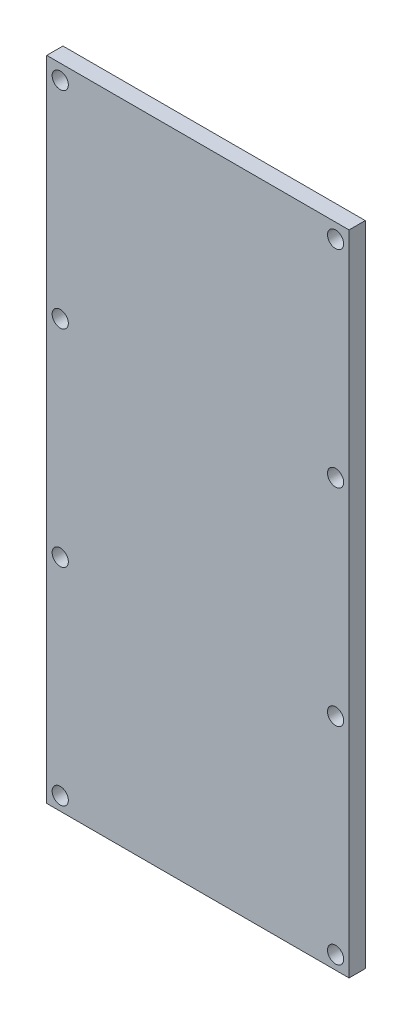
ISO-10303-21;
HEADER;
FILE_DESCRIPTION(('STEP AP214'),'2;1');
FILE_NAME('part.step','',(''),(''),'','','');
FILE_SCHEMA(('AUTOMOTIVE_DESIGN { 1 0 10303 214 1 1 1 1 }'));
ENDSEC;
DATA;
#1=APPLICATION_CONTEXT('core data for automotive mechanical design processes');
#2=APPLICATION_PROTOCOL_DEFINITION('international standard','automotive_design',2000,#1);
#3=PRODUCT_CONTEXT('',#1,'mechanical');
#4=PRODUCT('Part','Part','',(#3));
#5=PRODUCT_RELATED_PRODUCT_CATEGORY('part','',(#4));
#6=PRODUCT_DEFINITION_FORMATION('','',#4);
#7=PRODUCT_DEFINITION_CONTEXT('part definition',#1,'design');
#8=PRODUCT_DEFINITION('design','',#6,#7);
#9=PRODUCT_DEFINITION_SHAPE('','',#8);
#10=(LENGTH_UNIT() NAMED_UNIT(*) SI_UNIT(.MILLI.,.METRE.));
#11=(NAMED_UNIT(*) PLANE_ANGLE_UNIT() SI_UNIT($,.RADIAN.));
#12=(NAMED_UNIT(*) SI_UNIT($,.STERADIAN.) SOLID_ANGLE_UNIT());
#13=UNCERTAINTY_MEASURE_WITH_UNIT(LENGTH_MEASURE(1.E-05),#10,'distance_accuracy_value','');
#14=(GEOMETRIC_REPRESENTATION_CONTEXT(3) GLOBAL_UNCERTAINTY_ASSIGNED_CONTEXT((#13)) GLOBAL_UNIT_ASSIGNED_CONTEXT((#10,
#11,#12)) REPRESENTATION_CONTEXT('',''));
#15=CARTESIAN_POINT('',(0.,0.,0.));
#16=DIRECTION('',(0.,0.,1.));
#17=DIRECTION('',(1.,0.,0.));
#18=AXIS2_PLACEMENT_3D('',#15,#16,#17);
#19=CARTESIAN_POINT('',(0.,0.,0.));
#20=DIRECTION('',(0.,0.,-1.));
#21=DIRECTION('',(-1.,0.,0.));
#22=AXIS2_PLACEMENT_3D('',#19,#20,#21);
#23=PLANE('',#22);
#24=CARTESIAN_POINT('',(-60.5000000000004,104.25,0.));
#25=DIRECTION('',(0.,0.,1.));
#26=DIRECTION('',(1.,0.,0.));
#27=AXIS2_PLACEMENT_3D('',#24,#25,#26);
#28=CIRCLE('',#27,1.5);
#29=CARTESIAN_POINT('',(-59.0000000000004,104.25,0.));
#30=VERTEX_POINT('',#29);
#31=EDGE_CURVE('E162',#30,#30,#28,.T.);
#32=ORIENTED_EDGE('',*,*,#31,.T.);
#33=EDGE_LOOP('',(#32));
#34=FACE_BOUND('',#33,.T.);
#35=CARTESIAN_POINT('',(-60.5000000000001,27.75,0.));
#36=DIRECTION('',(0.,0.,1.));
#37=DIRECTION('',(1.,0.,0.));
#38=AXIS2_PLACEMENT_3D('',#35,#36,#37);
#39=CIRCLE('',#38,1.5);
#40=CARTESIAN_POINT('',(-59.0000000000001,27.75,0.));
#41=VERTEX_POINT('',#40);
#42=EDGE_CURVE('E186',#41,#41,#39,.T.);
#43=ORIENTED_EDGE('',*,*,#42,.T.);
#44=EDGE_LOOP('',(#43));
#45=FACE_BOUND('',#44,.T.);
#46=CARTESIAN_POINT('',(-111.5,65.9999999999996,0.));
#47=DIRECTION('',(0.,0.,1.));
#48=DIRECTION('',(1.,0.,0.));
#49=AXIS2_PLACEMENT_3D('',#46,#47,#48);
#50=CIRCLE('',#49,1.50000000000001);
#51=CARTESIAN_POINT('',(-110.,65.9999999999996,0.));
#52=VERTEX_POINT('',#51);
#53=EDGE_CURVE('E198',#52,#52,#50,.T.);
#54=ORIENTED_EDGE('',*,*,#53,.T.);
#55=EDGE_LOOP('',(#54));
#56=FACE_BOUND('',#55,.T.);
#57=CARTESIAN_POINT('',(-111.5,-10.5000000000004,0.));
#58=DIRECTION('',(0.,0.,1.));
#59=DIRECTION('',(1.,0.,0.));
#60=AXIS2_PLACEMENT_3D('',#57,#58,#59);
#61=CIRCLE('',#60,1.5);
#62=CARTESIAN_POINT('',(-110.,-10.5000000000004,0.));
#63=VERTEX_POINT('',#62);
#64=EDGE_CURVE('E210',#63,#63,#61,.T.);
#65=ORIENTED_EDGE('',*,*,#64,.T.);
#66=EDGE_LOOP('',(#65));
#67=FACE_BOUND('',#66,.T.);
#68=DIRECTION('',(0.,1.,0.));
#69=VECTOR('',#68,1.);
#70=CARTESIAN_POINT('',(-58.,107.,0.));
#71=LINE('',#70,#69);
#72=CARTESIAN_POINT('',(-58.,-13.,0.));
#73=VERTEX_POINT('',#72);
#74=CARTESIAN_POINT('',(-58.,107.,0.));
#75=VERTEX_POINT('',#74);
#76=EDGE_CURVE('E222',#73,#75,#71,.T.);
#77=ORIENTED_EDGE('',*,*,#76,.F.);
#78=DIRECTION('',(1.,0.,0.));
#79=VECTOR('',#78,1.);
#80=CARTESIAN_POINT('',(-58.,-13.,0.));
#81=LINE('',#80,#79);
#82=CARTESIAN_POINT('',(-114.,-13.,0.));
#83=VERTEX_POINT('',#82);
#84=EDGE_CURVE('E229',#83,#73,#81,.T.);
#85=ORIENTED_EDGE('',*,*,#84,.F.);
#86=DIRECTION('',(0.,-1.,0.));
#87=VECTOR('',#86,1.);
#88=CARTESIAN_POINT('',(-114.,107.,0.));
#89=LINE('',#88,#87);
#90=CARTESIAN_POINT('',(-114.,107.,0.));
#91=VERTEX_POINT('',#90);
#92=EDGE_CURVE('E240',#91,#83,#89,.T.);
#93=ORIENTED_EDGE('',*,*,#92,.F.);
#94=DIRECTION('',(-1.,0.,0.));
#95=VECTOR('',#94,1.);
#96=CARTESIAN_POINT('',(-58.,107.,0.));
#97=LINE('',#96,#95);
#98=EDGE_CURVE('E238',#75,#91,#97,.T.);
#99=ORIENTED_EDGE('',*,*,#98,.F.);
#100=EDGE_LOOP('',(#77,#85,#93,#99));
#101=FACE_BOUND('',#100,.T.);
#102=CARTESIAN_POINT('',(-60.5,-10.5,0.));
#103=DIRECTION('',(0.,0.,1.));
#104=DIRECTION('',(1.,0.,0.));
#105=AXIS2_PLACEMENT_3D('',#102,#103,#104);
#106=CIRCLE('',#105,1.5);
#107=CARTESIAN_POINT('',(-59.,-10.5,0.));
#108=VERTEX_POINT('',#107);
#109=EDGE_CURVE('E216',#108,#108,#106,.T.);
#110=ORIENTED_EDGE('',*,*,#109,.T.);
#111=EDGE_LOOP('',(#110));
#112=FACE_BOUND('',#111,.T.);
#113=CARTESIAN_POINT('',(-111.5,27.7499999999996,0.));
#114=DIRECTION('',(0.,0.,1.));
#115=DIRECTION('',(1.,0.,0.));
#116=AXIS2_PLACEMENT_3D('',#113,#114,#115);
#117=CIRCLE('',#116,1.50000000000001);
#118=CARTESIAN_POINT('',(-110.,27.7499999999996,0.));
#119=VERTEX_POINT('',#118);
#120=EDGE_CURVE('E204',#119,#119,#117,.T.);
#121=ORIENTED_EDGE('',*,*,#120,.T.);
#122=EDGE_LOOP('',(#121));
#123=FACE_BOUND('',#122,.T.);
#124=CARTESIAN_POINT('',(-111.5,104.25,0.));
#125=DIRECTION('',(0.,0.,1.));
#126=DIRECTION('',(1.,0.,0.));
#127=AXIS2_PLACEMENT_3D('',#124,#125,#126);
#128=CIRCLE('',#127,1.50000000000001);
#129=CARTESIAN_POINT('',(-110.,104.25,0.));
#130=VERTEX_POINT('',#129);
#131=EDGE_CURVE('E192',#130,#130,#128,.T.);
#132=ORIENTED_EDGE('',*,*,#131,.T.);
#133=EDGE_LOOP('',(#132));
#134=FACE_BOUND('',#133,.T.);
#135=CARTESIAN_POINT('',(-60.5000000000003,66.,0.));
#136=DIRECTION('',(0.,0.,1.));
#137=DIRECTION('',(1.,0.,0.));
#138=AXIS2_PLACEMENT_3D('',#135,#136,#137);
#139=CIRCLE('',#138,1.5);
#140=CARTESIAN_POINT('',(-59.0000000000003,66.,0.));
#141=VERTEX_POINT('',#140);
#142=EDGE_CURVE('E180',#141,#141,#139,.T.);
#143=ORIENTED_EDGE('',*,*,#142,.T.);
#144=EDGE_LOOP('',(#143));
#145=FACE_BOUND('',#144,.T.);
#146=DIRECTION('',(1.,0.,0.));
#147=VECTOR('',#146,1.);
#148=CARTESIAN_POINT('',(0.,-8.00000000000002,0.));
#149=LINE('',#148,#147);
#150=CARTESIAN_POINT('',(-109.,-8.00000000000001,0.));
#151=VERTEX_POINT('',#150);
#152=CARTESIAN_POINT('',(-63.,-8.00000000000001,0.));
#153=VERTEX_POINT('',#152);
#154=EDGE_CURVE('E42',#151,#153,#149,.T.);
#155=ORIENTED_EDGE('',*,*,#154,.T.);
#156=DIRECTION('',(0.,1.,0.));
#157=VECTOR('',#156,1.);
#158=CARTESIAN_POINT('',(-63.,0.,0.));
#159=LINE('',#158,#157);
#160=CARTESIAN_POINT('',(-63.,102.,0.));
#161=VERTEX_POINT('',#160);
#162=EDGE_CURVE('E11',#153,#161,#159,.T.);
#163=ORIENTED_EDGE('',*,*,#162,.T.);
#164=DIRECTION('',(1.,0.,0.));
#165=VECTOR('',#164,1.);
#166=CARTESIAN_POINT('',(0.,102.,0.));
#167=LINE('',#166,#165);
#168=CARTESIAN_POINT('',(-109.,102.,0.));
#169=VERTEX_POINT('',#168);
#170=EDGE_CURVE('E126',#169,#161,#167,.T.);
#171=ORIENTED_EDGE('',*,*,#170,.F.);
#172=DIRECTION('',(0.,1.,0.));
#173=VECTOR('',#172,1.);
#174=CARTESIAN_POINT('',(-109.,0.,0.));
#175=LINE('',#174,#173);
#176=EDGE_CURVE('E52',#151,#169,#175,.T.);
#177=ORIENTED_EDGE('',*,*,#176,.F.);
#178=EDGE_LOOP('',(#155,#163,#171,#177));
#179=FACE_BOUND('',#178,.T.);
#180=ADVANCED_FACE('F34',(#34,#45,#56,#67,#101,#112,#123,#134,#145,#179),#23,.T.);
#181=CARTESIAN_POINT('',(0.,0.,3.));
#182=DIRECTION('',(0.,0.,-1.));
#183=DIRECTION('',(-1.,0.,0.));
#184=AXIS2_PLACEMENT_3D('',#181,#182,#183);
#185=PLANE('',#184);
#186=CARTESIAN_POINT('',(-60.5000000000004,104.25,3.));
#187=DIRECTION('',(0.,0.,1.));
#188=DIRECTION('',(1.,0.,0.));
#189=AXIS2_PLACEMENT_3D('',#186,#187,#188);
#190=CIRCLE('',#189,1.5);
#191=CARTESIAN_POINT('',(-59.0000000000004,104.25,3.));
#192=VERTEX_POINT('',#191);
#193=EDGE_CURVE('E177',#192,#192,#190,.T.);
#194=ORIENTED_EDGE('',*,*,#193,.F.);
#195=EDGE_LOOP('',(#194));
#196=FACE_BOUND('',#195,.T.);
#197=CARTESIAN_POINT('',(-60.5000000000003,66.,3.));
#198=DIRECTION('',(0.,0.,1.));
#199=DIRECTION('',(1.,0.,0.));
#200=AXIS2_PLACEMENT_3D('',#197,#198,#199);
#201=CIRCLE('',#200,1.5);
#202=CARTESIAN_POINT('',(-59.0000000000003,66.,3.));
#203=VERTEX_POINT('',#202);
#204=EDGE_CURVE('E183',#203,#203,#201,.T.);
#205=ORIENTED_EDGE('',*,*,#204,.F.);
#206=EDGE_LOOP('',(#205));
#207=FACE_BOUND('',#206,.T.);
#208=CARTESIAN_POINT('',(-60.5000000000001,27.75,3.));
#209=DIRECTION('',(0.,0.,1.));
#210=DIRECTION('',(1.,0.,0.));
#211=AXIS2_PLACEMENT_3D('',#208,#209,#210);
#212=CIRCLE('',#211,1.5);
#213=CARTESIAN_POINT('',(-59.0000000000001,27.75,3.));
#214=VERTEX_POINT('',#213);
#215=EDGE_CURVE('E189',#214,#214,#212,.T.);
#216=ORIENTED_EDGE('',*,*,#215,.F.);
#217=EDGE_LOOP('',(#216));
#218=FACE_BOUND('',#217,.T.);
#219=CARTESIAN_POINT('',(-111.5,104.25,3.));
#220=DIRECTION('',(0.,0.,1.));
#221=DIRECTION('',(1.,0.,0.));
#222=AXIS2_PLACEMENT_3D('',#219,#220,#221);
#223=CIRCLE('',#222,1.50000000000001);
#224=CARTESIAN_POINT('',(-110.,104.25,3.));
#225=VERTEX_POINT('',#224);
#226=EDGE_CURVE('E195',#225,#225,#223,.T.);
#227=ORIENTED_EDGE('',*,*,#226,.F.);
#228=EDGE_LOOP('',(#227));
#229=FACE_BOUND('',#228,.T.);
#230=CARTESIAN_POINT('',(-111.5,65.9999999999996,3.));
#231=DIRECTION('',(0.,0.,1.));
#232=DIRECTION('',(1.,0.,0.));
#233=AXIS2_PLACEMENT_3D('',#230,#231,#232);
#234=CIRCLE('',#233,1.50000000000001);
#235=CARTESIAN_POINT('',(-110.,65.9999999999996,3.));
#236=VERTEX_POINT('',#235);
#237=EDGE_CURVE('E201',#236,#236,#234,.T.);
#238=ORIENTED_EDGE('',*,*,#237,.F.);
#239=EDGE_LOOP('',(#238));
#240=FACE_BOUND('',#239,.T.);
#241=CARTESIAN_POINT('',(-111.5,27.7499999999996,3.));
#242=DIRECTION('',(0.,0.,1.));
#243=DIRECTION('',(1.,0.,0.));
#244=AXIS2_PLACEMENT_3D('',#241,#242,#243);
#245=CIRCLE('',#244,1.50000000000001);
#246=CARTESIAN_POINT('',(-110.,27.7499999999996,3.));
#247=VERTEX_POINT('',#246);
#248=EDGE_CURVE('E207',#247,#247,#245,.T.);
#249=ORIENTED_EDGE('',*,*,#248,.F.);
#250=EDGE_LOOP('',(#249));
#251=FACE_BOUND('',#250,.T.);
#252=CARTESIAN_POINT('',(-111.5,-10.5000000000004,3.));
#253=DIRECTION('',(0.,0.,1.));
#254=DIRECTION('',(1.,0.,0.));
#255=AXIS2_PLACEMENT_3D('',#252,#253,#254);
#256=CIRCLE('',#255,1.5);
#257=CARTESIAN_POINT('',(-110.,-10.5000000000004,3.));
#258=VERTEX_POINT('',#257);
#259=EDGE_CURVE('E213',#258,#258,#256,.T.);
#260=ORIENTED_EDGE('',*,*,#259,.F.);
#261=EDGE_LOOP('',(#260));
#262=FACE_BOUND('',#261,.T.);
#263=CARTESIAN_POINT('',(-60.5,-10.5,3.));
#264=DIRECTION('',(0.,0.,1.));
#265=DIRECTION('',(1.,0.,0.));
#266=AXIS2_PLACEMENT_3D('',#263,#264,#265);
#267=CIRCLE('',#266,1.5);
#268=CARTESIAN_POINT('',(-59.,-10.5,3.));
#269=VERTEX_POINT('',#268);
#270=EDGE_CURVE('E219',#269,#269,#267,.T.);
#271=ORIENTED_EDGE('',*,*,#270,.F.);
#272=EDGE_LOOP('',(#271));
#273=FACE_BOUND('',#272,.T.);
#274=DIRECTION('',(0.,1.,0.));
#275=VECTOR('',#274,1.);
#276=CARTESIAN_POINT('',(-58.,107.,3.));
#277=LINE('',#276,#275);
#278=CARTESIAN_POINT('',(-58.,-13.,3.));
#279=VERTEX_POINT('',#278);
#280=CARTESIAN_POINT('',(-58.,107.,3.));
#281=VERTEX_POINT('',#280);
#282=EDGE_CURVE('E225',#279,#281,#277,.T.);
#283=ORIENTED_EDGE('',*,*,#282,.T.);
#284=DIRECTION('',(-1.,0.,0.));
#285=VECTOR('',#284,1.);
#286=CARTESIAN_POINT('',(-58.,107.,3.));
#287=LINE('',#286,#285);
#288=CARTESIAN_POINT('',(-114.,107.,3.));
#289=VERTEX_POINT('',#288);
#290=EDGE_CURVE('E228',#281,#289,#287,.T.);
#291=ORIENTED_EDGE('',*,*,#290,.T.);
#292=DIRECTION('',(0.,-1.,0.));
#293=VECTOR('',#292,1.);
#294=CARTESIAN_POINT('',(-114.,107.,3.));
#295=LINE('',#294,#293);
#296=CARTESIAN_POINT('',(-114.,-13.,3.));
#297=VERTEX_POINT('',#296);
#298=EDGE_CURVE('E231',#289,#297,#295,.T.);
#299=ORIENTED_EDGE('',*,*,#298,.T.);
#300=DIRECTION('',(1.,0.,0.));
#301=VECTOR('',#300,1.);
#302=CARTESIAN_POINT('',(-58.,-13.,3.));
#303=LINE('',#302,#301);
#304=EDGE_CURVE('E233',#297,#279,#303,.T.);
#305=ORIENTED_EDGE('',*,*,#304,.T.);
#306=EDGE_LOOP('',(#283,#291,#299,#305));
#307=FACE_BOUND('',#306,.T.);
#308=ADVANCED_FACE('F281',(#196,#207,#218,#229,#240,#251,#262,#273,#307),#185,.F.);
#309=CARTESIAN_POINT('',(-58.,107.,3.));
#310=DIRECTION('',(-1.,0.,0.));
#311=DIRECTION('',(0.,0.,1.));
#312=AXIS2_PLACEMENT_3D('',#309,#310,#311);
#313=PLANE('',#312);
#314=ORIENTED_EDGE('',*,*,#76,.T.);
#315=DIRECTION('',(0.,0.,-1.));
#316=VECTOR('',#315,1.);
#317=CARTESIAN_POINT('',(-58.,107.,3.));
#318=LINE('',#317,#316);
#319=EDGE_CURVE('E251',#281,#75,#318,.T.);
#320=ORIENTED_EDGE('',*,*,#319,.F.);
#321=ORIENTED_EDGE('',*,*,#282,.F.);
#322=DIRECTION('',(0.,0.,-1.));
#323=VECTOR('',#322,1.);
#324=CARTESIAN_POINT('',(-58.,-13.,3.));
#325=LINE('',#324,#323);
#326=EDGE_CURVE('E235',#279,#73,#325,.T.);
#327=ORIENTED_EDGE('',*,*,#326,.T.);
#328=EDGE_LOOP('',(#314,#320,#321,#327));
#329=FACE_BOUND('',#328,.T.);
#330=ADVANCED_FACE('F36',(#329),#313,.F.);
#331=CARTESIAN_POINT('',(-58.,107.,3.));
#332=DIRECTION('',(0.,-1.,0.));
#333=DIRECTION('',(0.,0.,-1.));
#334=AXIS2_PLACEMENT_3D('',#331,#332,#333);
#335=PLANE('',#334);
#336=ORIENTED_EDGE('',*,*,#98,.T.);
#337=DIRECTION('',(0.,0.,-1.));
#338=VECTOR('',#337,1.);
#339=CARTESIAN_POINT('',(-114.,107.,3.));
#340=LINE('',#339,#338);
#341=EDGE_CURVE('E248',#289,#91,#340,.T.);
#342=ORIENTED_EDGE('',*,*,#341,.F.);
#343=ORIENTED_EDGE('',*,*,#290,.F.);
#344=ORIENTED_EDGE('',*,*,#319,.T.);
#345=EDGE_LOOP('',(#336,#342,#343,#344));
#346=FACE_BOUND('',#345,.T.);
#347=ADVANCED_FACE('F388',(#346),#335,.F.);
#348=CARTESIAN_POINT('',(-114.,107.,3.));
#349=DIRECTION('',(1.,0.,0.));
#350=DIRECTION('',(0.,0.,-1.));
#351=AXIS2_PLACEMENT_3D('',#348,#349,#350);
#352=PLANE('',#351);
#353=ORIENTED_EDGE('',*,*,#92,.T.);
#354=DIRECTION('',(0.,0.,-1.));
#355=VECTOR('',#354,1.);
#356=CARTESIAN_POINT('',(-114.,-13.,3.));
#357=LINE('',#356,#355);
#358=EDGE_CURVE('E245',#297,#83,#357,.T.);
#359=ORIENTED_EDGE('',*,*,#358,.F.);
#360=ORIENTED_EDGE('',*,*,#298,.F.);
#361=ORIENTED_EDGE('',*,*,#341,.T.);
#362=EDGE_LOOP('',(#353,#359,#360,#361));
#363=FACE_BOUND('',#362,.T.);
#364=ADVANCED_FACE('F363',(#363),#352,.F.);
#365=CARTESIAN_POINT('',(-58.,-13.,3.));
#366=DIRECTION('',(0.,1.,0.));
#367=DIRECTION('',(0.,0.,1.));
#368=AXIS2_PLACEMENT_3D('',#365,#366,#367);
#369=PLANE('',#368);
#370=ORIENTED_EDGE('',*,*,#84,.T.);
#371=ORIENTED_EDGE('',*,*,#326,.F.);
#372=ORIENTED_EDGE('',*,*,#304,.F.);
#373=ORIENTED_EDGE('',*,*,#358,.T.);
#374=EDGE_LOOP('',(#370,#371,#372,#373));
#375=FACE_BOUND('',#374,.T.);
#376=ADVANCED_FACE('F358',(#375),#369,.F.);
#377=CARTESIAN_POINT('',(-60.5,-10.5,3.));
#378=DIRECTION('',(0.,0.,-1.));
#379=DIRECTION('',(-1.,0.,0.));
#380=AXIS2_PLACEMENT_3D('',#377,#378,#379);
#381=CYLINDRICAL_SURFACE('',#380,1.5);
#382=ORIENTED_EDGE('',*,*,#270,.T.);
#383=EDGE_LOOP('',(#382));
#384=FACE_BOUND('',#383,.T.);
#385=ORIENTED_EDGE('',*,*,#109,.F.);
#386=EDGE_LOOP('',(#385));
#387=FACE_BOUND('',#386,.T.);
#388=ADVANCED_FACE('F355',(#384,#387),#381,.F.);
#389=CARTESIAN_POINT('',(-111.5,-10.5000000000004,3.));
#390=DIRECTION('',(0.,0.,-1.));
#391=DIRECTION('',(-1.,0.,0.));
#392=AXIS2_PLACEMENT_3D('',#389,#390,#391);
#393=CYLINDRICAL_SURFACE('',#392,1.5);
#394=ORIENTED_EDGE('',*,*,#259,.T.);
#395=EDGE_LOOP('',(#394));
#396=FACE_BOUND('',#395,.T.);
#397=ORIENTED_EDGE('',*,*,#64,.F.);
#398=EDGE_LOOP('',(#397));
#399=FACE_BOUND('',#398,.T.);
#400=ADVANCED_FACE('F351',(#396,#399),#393,.F.);
#401=CARTESIAN_POINT('',(-111.5,27.7499999999996,3.));
#402=DIRECTION('',(0.,0.,-1.));
#403=DIRECTION('',(-1.,0.,0.));
#404=AXIS2_PLACEMENT_3D('',#401,#402,#403);
#405=CYLINDRICAL_SURFACE('',#404,1.50000000000001);
#406=ORIENTED_EDGE('',*,*,#248,.T.);
#407=EDGE_LOOP('',(#406));
#408=FACE_BOUND('',#407,.T.);
#409=ORIENTED_EDGE('',*,*,#120,.F.);
#410=EDGE_LOOP('',(#409));
#411=FACE_BOUND('',#410,.T.);
#412=ADVANCED_FACE('F347',(#408,#411),#405,.F.);
#413=CARTESIAN_POINT('',(-111.5,65.9999999999996,3.));
#414=DIRECTION('',(0.,0.,-1.));
#415=DIRECTION('',(-1.,0.,0.));
#416=AXIS2_PLACEMENT_3D('',#413,#414,#415);
#417=CYLINDRICAL_SURFACE('',#416,1.50000000000001);
#418=ORIENTED_EDGE('',*,*,#237,.T.);
#419=EDGE_LOOP('',(#418));
#420=FACE_BOUND('',#419,.T.);
#421=ORIENTED_EDGE('',*,*,#53,.F.);
#422=EDGE_LOOP('',(#421));
#423=FACE_BOUND('',#422,.T.);
#424=ADVANCED_FACE('F343',(#420,#423),#417,.F.);
#425=CARTESIAN_POINT('',(-111.5,104.25,3.));
#426=DIRECTION('',(0.,0.,-1.));
#427=DIRECTION('',(-1.,0.,0.));
#428=AXIS2_PLACEMENT_3D('',#425,#426,#427);
#429=CYLINDRICAL_SURFACE('',#428,1.50000000000001);
#430=ORIENTED_EDGE('',*,*,#226,.T.);
#431=EDGE_LOOP('',(#430));
#432=FACE_BOUND('',#431,.T.);
#433=ORIENTED_EDGE('',*,*,#131,.F.);
#434=EDGE_LOOP('',(#433));
#435=FACE_BOUND('',#434,.T.);
#436=ADVANCED_FACE('F339',(#432,#435),#429,.F.);
#437=CARTESIAN_POINT('',(-60.5000000000001,27.75,3.));
#438=DIRECTION('',(0.,0.,-1.));
#439=DIRECTION('',(-1.,0.,0.));
#440=AXIS2_PLACEMENT_3D('',#437,#438,#439);
#441=CYLINDRICAL_SURFACE('',#440,1.5);
#442=ORIENTED_EDGE('',*,*,#215,.T.);
#443=EDGE_LOOP('',(#442));
#444=FACE_BOUND('',#443,.T.);
#445=ORIENTED_EDGE('',*,*,#42,.F.);
#446=EDGE_LOOP('',(#445));
#447=FACE_BOUND('',#446,.T.);
#448=ADVANCED_FACE('F331',(#444,#447),#441,.F.);
#449=CARTESIAN_POINT('',(-60.5000000000003,66.,3.));
#450=DIRECTION('',(0.,0.,-1.));
#451=DIRECTION('',(-1.,0.,0.));
#452=AXIS2_PLACEMENT_3D('',#449,#450,#451);
#453=CYLINDRICAL_SURFACE('',#452,1.5);
#454=ORIENTED_EDGE('',*,*,#204,.T.);
#455=EDGE_LOOP('',(#454));
#456=FACE_BOUND('',#455,.T.);
#457=ORIENTED_EDGE('',*,*,#142,.F.);
#458=EDGE_LOOP('',(#457));
#459=FACE_BOUND('',#458,.T.);
#460=ADVANCED_FACE('F325',(#456,#459),#453,.F.);
#461=CARTESIAN_POINT('',(-60.5000000000004,104.25,3.));
#462=DIRECTION('',(0.,0.,-1.));
#463=DIRECTION('',(-1.,0.,0.));
#464=AXIS2_PLACEMENT_3D('',#461,#462,#463);
#465=CYLINDRICAL_SURFACE('',#464,1.5);
#466=ORIENTED_EDGE('',*,*,#193,.T.);
#467=EDGE_LOOP('',(#466));
#468=FACE_BOUND('',#467,.T.);
#469=ORIENTED_EDGE('',*,*,#31,.F.);
#470=EDGE_LOOP('',(#469));
#471=FACE_BOUND('',#470,.T.);
#472=ADVANCED_FACE('F321',(#468,#471),#465,.F.);
#473=CARTESIAN_POINT('',(0.,100.5,-3.));
#474=DIRECTION('',(0.,1.,0.));
#475=DIRECTION('',(0.,0.,1.));
#476=AXIS2_PLACEMENT_3D('',#473,#474,#475);
#477=PLANE('',#476);
#478=DIRECTION('',(1.,0.,0.));
#479=VECTOR('',#478,1.);
#480=CARTESIAN_POINT('',(0.,100.5,0.));
#481=LINE('',#480,#479);
#482=CARTESIAN_POINT('',(-107.5,100.5,0.));
#483=VERTEX_POINT('',#482);
#484=CARTESIAN_POINT('',(-64.5,100.5,0.));
#485=VERTEX_POINT('',#484);
#486=EDGE_CURVE('E262',#483,#485,#481,.T.);
#487=ORIENTED_EDGE('',*,*,#486,.F.);
#488=DIRECTION('',(0.,0.,1.));
#489=VECTOR('',#488,1.);
#490=CARTESIAN_POINT('',(-107.5,100.5,-3.));
#491=LINE('',#490,#489);
#492=CARTESIAN_POINT('',(-107.5,100.5,-3.));
#493=VERTEX_POINT('',#492);
#494=EDGE_CURVE('E159',#493,#483,#491,.T.);
#495=ORIENTED_EDGE('',*,*,#494,.F.);
#496=DIRECTION('',(-1.,0.,0.));
#497=VECTOR('',#496,1.);
#498=CARTESIAN_POINT('',(0.,100.5,-3.));
#499=LINE('',#498,#497);
#500=CARTESIAN_POINT('',(-64.5,100.5,-3.));
#501=VERTEX_POINT('',#500);
#502=EDGE_CURVE('E149',#501,#493,#499,.T.);
#503=ORIENTED_EDGE('',*,*,#502,.F.);
#504=DIRECTION('',(0.,0.,1.));
#505=VECTOR('',#504,1.);
#506=CARTESIAN_POINT('',(-64.5,100.5,-3.));
#507=LINE('',#506,#505);
#508=EDGE_CURVE('E169',#501,#485,#507,.T.);
#509=ORIENTED_EDGE('',*,*,#508,.T.);
#510=EDGE_LOOP('',(#487,#495,#503,#509));
#511=FACE_BOUND('',#510,.T.);
#512=ADVANCED_FACE('F305',(#511),#477,.F.);
#513=CARTESIAN_POINT('',(-107.5,0.,-3.));
#514=DIRECTION('',(-1.,0.,0.));
#515=DIRECTION('',(0.,-1.,0.));
#516=AXIS2_PLACEMENT_3D('',#513,#514,#515);
#517=PLANE('',#516);
#518=DIRECTION('',(0.,1.,0.));
#519=VECTOR('',#518,1.);
#520=CARTESIAN_POINT('',(-107.5,0.,0.));
#521=LINE('',#520,#519);
#522=CARTESIAN_POINT('',(-107.5,-6.50000000000001,0.));
#523=VERTEX_POINT('',#522);
#524=EDGE_CURVE('E260',#523,#483,#521,.T.);
#525=ORIENTED_EDGE('',*,*,#524,.F.);
#526=DIRECTION('',(0.,0.,1.));
#527=VECTOR('',#526,1.);
#528=CARTESIAN_POINT('',(-107.5,-6.50000000000001,-3.));
#529=LINE('',#528,#527);
#530=CARTESIAN_POINT('',(-107.5,-6.50000000000001,-3.));
#531=VERTEX_POINT('',#530);
#532=EDGE_CURVE('E163',#531,#523,#529,.T.);
#533=ORIENTED_EDGE('',*,*,#532,.F.);
#534=DIRECTION('',(0.,-1.,0.));
#535=VECTOR('',#534,1.);
#536=CARTESIAN_POINT('',(-107.5,0.,-3.));
#537=LINE('',#536,#535);
#538=EDGE_CURVE('E129',#493,#531,#537,.T.);
#539=ORIENTED_EDGE('',*,*,#538,.F.);
#540=ORIENTED_EDGE('',*,*,#494,.T.);
#541=EDGE_LOOP('',(#525,#533,#539,#540));
#542=FACE_BOUND('',#541,.T.);
#543=ADVANCED_FACE('F307',(#542),#517,.F.);
#544=CARTESIAN_POINT('',(0.,-6.5,-3.));
#545=DIRECTION('',(0.,1.,0.));
#546=DIRECTION('',(-1.,0.,0.));
#547=AXIS2_PLACEMENT_3D('',#544,#545,#546);
#548=PLANE('',#547);
#549=ORIENTED_EDGE('',*,*,#532,.T.);
#550=DIRECTION('',(1.,0.,0.));
#551=VECTOR('',#550,1.);
#552=CARTESIAN_POINT('',(0.,-6.5,0.));
#553=LINE('',#552,#551);
#554=CARTESIAN_POINT('',(-64.5,-6.50000000000001,0.));
#555=VERTEX_POINT('',#554);
#556=EDGE_CURVE('E257',#523,#555,#553,.T.);
#557=ORIENTED_EDGE('',*,*,#556,.T.);
#558=DIRECTION('',(0.,0.,1.));
#559=VECTOR('',#558,1.);
#560=CARTESIAN_POINT('',(-64.5,-6.50000000000001,-3.));
#561=LINE('',#560,#559);
#562=CARTESIAN_POINT('',(-64.5,-6.50000000000001,-3.));
#563=VERTEX_POINT('',#562);
#564=EDGE_CURVE('E166',#563,#555,#561,.T.);
#565=ORIENTED_EDGE('',*,*,#564,.F.);
#566=DIRECTION('',(-1.,0.,0.));
#567=VECTOR('',#566,1.);
#568=CARTESIAN_POINT('',(0.,-6.5,-3.));
#569=LINE('',#568,#567);
#570=EDGE_CURVE('E155',#563,#531,#569,.T.);
#571=ORIENTED_EDGE('',*,*,#570,.T.);
#572=EDGE_LOOP('',(#549,#557,#565,#571));
#573=FACE_BOUND('',#572,.T.);
#574=ADVANCED_FACE('F277',(#573),#548,.T.);
#575=CARTESIAN_POINT('',(-63.,0.,-3.));
#576=DIRECTION('',(-1.,0.,0.));
#577=DIRECTION('',(0.,0.,1.));
#578=AXIS2_PLACEMENT_3D('',#575,#576,#577);
#579=PLANE('',#578);
#580=ORIENTED_EDGE('',*,*,#162,.F.);
#581=DIRECTION('',(0.,0.,1.));
#582=VECTOR('',#581,1.);
#583=CARTESIAN_POINT('',(-63.,-8.00000000000001,-3.));
#584=LINE('',#583,#582);
#585=CARTESIAN_POINT('',(-63.,-8.00000000000001,-3.));
#586=VERTEX_POINT('',#585);
#587=EDGE_CURVE('E136',#586,#153,#584,.T.);
#588=ORIENTED_EDGE('',*,*,#587,.F.);
#589=DIRECTION('',(0.,-1.,0.));
#590=VECTOR('',#589,1.);
#591=CARTESIAN_POINT('',(-63.,0.,-3.));
#592=LINE('',#591,#590);
#593=CARTESIAN_POINT('',(-63.,102.,-3.));
#594=VERTEX_POINT('',#593);
#595=EDGE_CURVE('E133',#594,#586,#592,.T.);
#596=ORIENTED_EDGE('',*,*,#595,.F.);
#597=DIRECTION('',(0.,0.,1.));
#598=VECTOR('',#597,1.);
#599=CARTESIAN_POINT('',(-63.,102.,-3.));
#600=LINE('',#599,#598);
#601=EDGE_CURVE('E120',#594,#161,#600,.T.);
#602=ORIENTED_EDGE('',*,*,#601,.T.);
#603=EDGE_LOOP('',(#580,#588,#596,#602));
#604=FACE_BOUND('',#603,.T.);
#605=ADVANCED_FACE('F134',(#604),#579,.F.);
#606=CARTESIAN_POINT('',(0.,-8.00000000000002,-3.));
#607=DIRECTION('',(0.,1.,0.));
#608=DIRECTION('',(-1.,0.,0.));
#609=AXIS2_PLACEMENT_3D('',#606,#607,#608);
#610=PLANE('',#609);
#611=ORIENTED_EDGE('',*,*,#154,.F.);
#612=DIRECTION('',(0.,0.,1.));
#613=VECTOR('',#612,1.);
#614=CARTESIAN_POINT('',(-109.,-8.00000000000001,-3.));
#615=LINE('',#614,#613);
#616=CARTESIAN_POINT('',(-109.,-8.00000000000001,-3.));
#617=VERTEX_POINT('',#616);
#618=EDGE_CURVE('E173',#617,#151,#615,.T.);
#619=ORIENTED_EDGE('',*,*,#618,.F.);
#620=DIRECTION('',(-1.,0.,0.));
#621=VECTOR('',#620,1.);
#622=CARTESIAN_POINT('',(0.,-8.00000000000002,-3.));
#623=LINE('',#622,#621);
#624=EDGE_CURVE('E145',#586,#617,#623,.T.);
#625=ORIENTED_EDGE('',*,*,#624,.F.);
#626=ORIENTED_EDGE('',*,*,#587,.T.);
#627=EDGE_LOOP('',(#611,#619,#625,#626));
#628=FACE_BOUND('',#627,.T.);
#629=ADVANCED_FACE('F269',(#628),#610,.F.);
#630=CARTESIAN_POINT('',(-109.,0.,-3.));
#631=DIRECTION('',(-1.,0.,0.));
#632=DIRECTION('',(0.,0.,1.));
#633=AXIS2_PLACEMENT_3D('',#630,#631,#632);
#634=PLANE('',#633);
#635=ORIENTED_EDGE('',*,*,#618,.T.);
#636=ORIENTED_EDGE('',*,*,#176,.T.);
#637=DIRECTION('',(0.,0.,1.));
#638=VECTOR('',#637,1.);
#639=CARTESIAN_POINT('',(-109.,102.,-3.));
#640=LINE('',#639,#638);
#641=CARTESIAN_POINT('',(-109.,102.,-3.));
#642=VERTEX_POINT('',#641);
#643=EDGE_CURVE('E128',#642,#169,#640,.T.);
#644=ORIENTED_EDGE('',*,*,#643,.F.);
#645=DIRECTION('',(0.,-1.,0.));
#646=VECTOR('',#645,1.);
#647=CARTESIAN_POINT('',(-109.,0.,-3.));
#648=LINE('',#647,#646);
#649=EDGE_CURVE('E143',#642,#617,#648,.T.);
#650=ORIENTED_EDGE('',*,*,#649,.T.);
#651=EDGE_LOOP('',(#635,#636,#644,#650));
#652=FACE_BOUND('',#651,.T.);
#653=ADVANCED_FACE('F266',(#652),#634,.T.);
#654=CARTESIAN_POINT('',(0.,102.,-3.));
#655=DIRECTION('',(0.,1.,0.));
#656=DIRECTION('',(0.,0.,1.));
#657=AXIS2_PLACEMENT_3D('',#654,#655,#656);
#658=PLANE('',#657);
#659=ORIENTED_EDGE('',*,*,#643,.T.);
#660=ORIENTED_EDGE('',*,*,#170,.T.);
#661=ORIENTED_EDGE('',*,*,#601,.F.);
#662=DIRECTION('',(-1.,0.,0.));
#663=VECTOR('',#662,1.);
#664=CARTESIAN_POINT('',(0.,102.,-3.));
#665=LINE('',#664,#663);
#666=EDGE_CURVE('E125',#594,#642,#665,.T.);
#667=ORIENTED_EDGE('',*,*,#666,.T.);
#668=EDGE_LOOP('',(#659,#660,#661,#667));
#669=FACE_BOUND('',#668,.T.);
#670=ADVANCED_FACE('F123',(#669),#658,.T.);
#671=CARTESIAN_POINT('',(-64.5,0.,-3.));
#672=DIRECTION('',(-1.,0.,0.));
#673=DIRECTION('',(0.,-1.,0.));
#674=AXIS2_PLACEMENT_3D('',#671,#672,#673);
#675=PLANE('',#674);
#676=ORIENTED_EDGE('',*,*,#564,.T.);
#677=DIRECTION('',(0.,1.,0.));
#678=VECTOR('',#677,1.);
#679=CARTESIAN_POINT('',(-64.5,0.,0.));
#680=LINE('',#679,#678);
#681=EDGE_CURVE('E254',#555,#485,#680,.T.);
#682=ORIENTED_EDGE('',*,*,#681,.T.);
#683=ORIENTED_EDGE('',*,*,#508,.F.);
#684=DIRECTION('',(0.,-1.,0.));
#685=VECTOR('',#684,1.);
#686=CARTESIAN_POINT('',(-64.5,0.,-3.));
#687=LINE('',#686,#685);
#688=EDGE_CURVE('E152',#501,#563,#687,.T.);
#689=ORIENTED_EDGE('',*,*,#688,.T.);
#690=EDGE_LOOP('',(#676,#682,#683,#689));
#691=FACE_BOUND('',#690,.T.);
#692=ADVANCED_FACE('F297',(#691),#675,.T.);
#693=CARTESIAN_POINT('',(0.,0.,-3.));
#694=DIRECTION('',(0.,0.,1.));
#695=DIRECTION('',(1.,0.,0.));
#696=AXIS2_PLACEMENT_3D('',#693,#694,#695);
#697=PLANE('',#696);
#698=ORIENTED_EDGE('',*,*,#595,.T.);
#699=ORIENTED_EDGE('',*,*,#624,.T.);
#700=ORIENTED_EDGE('',*,*,#649,.F.);
#701=ORIENTED_EDGE('',*,*,#666,.F.);
#702=EDGE_LOOP('',(#698,#699,#700,#701));
#703=FACE_BOUND('',#702,.T.);
#704=ORIENTED_EDGE('',*,*,#502,.T.);
#705=ORIENTED_EDGE('',*,*,#538,.T.);
#706=ORIENTED_EDGE('',*,*,#570,.F.);
#707=ORIENTED_EDGE('',*,*,#688,.F.);
#708=EDGE_LOOP('',(#704,#705,#706,#707));
#709=FACE_BOUND('',#708,.T.);
#710=ADVANCED_FACE('F140',(#703,#709),#697,.F.);
#711=ORIENTED_EDGE('',*,*,#524,.T.);
#712=ORIENTED_EDGE('',*,*,#486,.T.);
#713=ORIENTED_EDGE('',*,*,#681,.F.);
#714=ORIENTED_EDGE('',*,*,#556,.F.);
#715=EDGE_LOOP('',(#711,#712,#713,#714));
#716=FACE_BOUND('',#715,.T.);
#717=ADVANCED_FACE('F284',(#716),#23,.T.);
#718=CLOSED_SHELL('',(#180,#308,#330,#347,#364,#376,#388,#400,#412,#424,#436,#448,#460,#472,
#512,#543,#574,#605,#629,#653,#670,#692,#710,#717));
#719=MANIFOLD_SOLID_BREP('B2',#718);
#720=ADVANCED_BREP_SHAPE_REPRESENTATION('',(#18,#719),#14);
#721=SHAPE_DEFINITION_REPRESENTATION(#9,#720);
ENDSEC;
END-ISO-10303-21;
